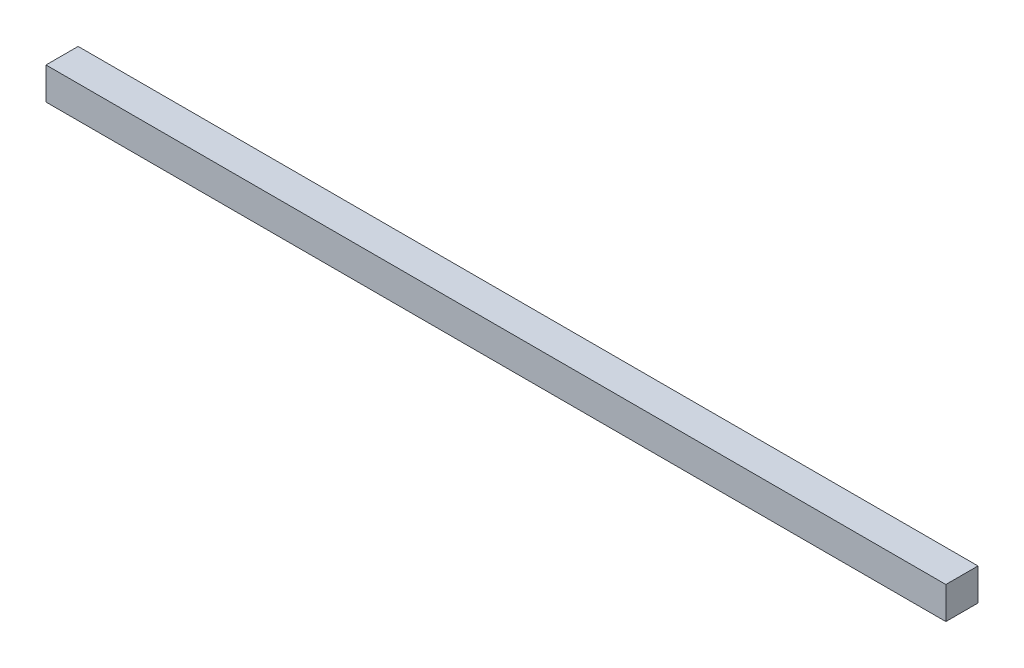
ISO-10303-21;
HEADER;
FILE_DESCRIPTION(('STEP AP214'),'2;1');
FILE_NAME('part.step','',(''),(''),'','','');
FILE_SCHEMA(('AUTOMOTIVE_DESIGN { 1 0 10303 214 1 1 1 1 }'));
ENDSEC;
DATA;
#1=APPLICATION_CONTEXT('core data for automotive mechanical design processes');
#2=APPLICATION_PROTOCOL_DEFINITION('international standard','automotive_design',2000,#1);
#3=PRODUCT_CONTEXT('',#1,'mechanical');
#4=PRODUCT('Part','Part','',(#3));
#5=PRODUCT_RELATED_PRODUCT_CATEGORY('part','',(#4));
#6=PRODUCT_DEFINITION_FORMATION('','',#4);
#7=PRODUCT_DEFINITION_CONTEXT('part definition',#1,'design');
#8=PRODUCT_DEFINITION('design','',#6,#7);
#9=PRODUCT_DEFINITION_SHAPE('','',#8);
#10=(LENGTH_UNIT() NAMED_UNIT(*) SI_UNIT(.MILLI.,.METRE.));
#11=(NAMED_UNIT(*) PLANE_ANGLE_UNIT() SI_UNIT($,.RADIAN.));
#12=(NAMED_UNIT(*) SI_UNIT($,.STERADIAN.) SOLID_ANGLE_UNIT());
#13=UNCERTAINTY_MEASURE_WITH_UNIT(LENGTH_MEASURE(1.E-05),#10,'distance_accuracy_value','');
#14=(GEOMETRIC_REPRESENTATION_CONTEXT(3) GLOBAL_UNCERTAINTY_ASSIGNED_CONTEXT((#13)) GLOBAL_UNIT_ASSIGNED_CONTEXT((#10,
#11,#12)) REPRESENTATION_CONTEXT('',''));
#15=CARTESIAN_POINT('',(0.,0.,0.));
#16=DIRECTION('',(0.,0.,1.));
#17=DIRECTION('',(1.,0.,0.));
#18=AXIS2_PLACEMENT_3D('',#15,#16,#17);
#19=CARTESIAN_POINT('',(0.,25.,25.));
#20=DIRECTION('',(1.,0.,0.));
#21=DIRECTION('',(0.,0.,-1.));
#22=AXIS2_PLACEMENT_3D('',#19,#20,#21);
#23=PLANE('',#22);
#24=DIRECTION('',(0.,-1.,0.));
#25=VECTOR('',#24,1.);
#26=CARTESIAN_POINT('',(0.,25.,0.));
#27=LINE('',#26,#25);
#28=CARTESIAN_POINT('',(0.,25.,0.));
#29=VERTEX_POINT('',#28);
#30=CARTESIAN_POINT('',(0.,0.,0.));
#31=VERTEX_POINT('',#30);
#32=EDGE_CURVE('E102',#29,#31,#27,.T.);
#33=ORIENTED_EDGE('',*,*,#32,.T.);
#34=DIRECTION('',(0.,0.,-1.));
#35=VECTOR('',#34,1.);
#36=CARTESIAN_POINT('',(0.,0.,25.));
#37=LINE('',#36,#35);
#38=CARTESIAN_POINT('',(0.,0.,25.));
#39=VERTEX_POINT('',#38);
#40=EDGE_CURVE('E11',#39,#31,#37,.T.);
#41=ORIENTED_EDGE('',*,*,#40,.F.);
#42=DIRECTION('',(0.,-1.,0.));
#43=VECTOR('',#42,1.);
#44=CARTESIAN_POINT('',(0.,25.,25.));
#45=LINE('',#44,#43);
#46=CARTESIAN_POINT('',(0.,25.,25.));
#47=VERTEX_POINT('',#46);
#48=EDGE_CURVE('E90',#47,#39,#45,.T.);
#49=ORIENTED_EDGE('',*,*,#48,.F.);
#50=DIRECTION('',(0.,0.,-1.));
#51=VECTOR('',#50,1.);
#52=CARTESIAN_POINT('',(0.,25.,25.));
#53=LINE('',#52,#51);
#54=EDGE_CURVE('E98',#47,#29,#53,.T.);
#55=ORIENTED_EDGE('',*,*,#54,.T.);
#56=EDGE_LOOP('',(#33,#41,#49,#55));
#57=FACE_BOUND('',#56,.T.);
#58=ADVANCED_FACE('F39',(#57),#23,.F.);
#59=CARTESIAN_POINT('',(0.,0.,25.));
#60=DIRECTION('',(0.,1.,0.));
#61=DIRECTION('',(0.,0.,1.));
#62=AXIS2_PLACEMENT_3D('',#59,#60,#61);
#63=PLANE('',#62);
#64=DIRECTION('',(1.,0.,0.));
#65=VECTOR('',#64,1.);
#66=CARTESIAN_POINT('',(0.,0.,0.));
#67=LINE('',#66,#65);
#68=CARTESIAN_POINT('',(700.,0.,0.));
#69=VERTEX_POINT('',#68);
#70=EDGE_CURVE('E94',#31,#69,#67,.T.);
#71=ORIENTED_EDGE('',*,*,#70,.T.);
#72=DIRECTION('',(0.,0.,-1.));
#73=VECTOR('',#72,1.);
#74=CARTESIAN_POINT('',(700.,0.,25.));
#75=LINE('',#74,#73);
#76=CARTESIAN_POINT('',(700.,0.,25.));
#77=VERTEX_POINT('',#76);
#78=EDGE_CURVE('E47',#77,#69,#75,.T.);
#79=ORIENTED_EDGE('',*,*,#78,.F.);
#80=DIRECTION('',(1.,0.,0.));
#81=VECTOR('',#80,1.);
#82=CARTESIAN_POINT('',(0.,0.,25.));
#83=LINE('',#82,#81);
#84=EDGE_CURVE('E85',#39,#77,#83,.T.);
#85=ORIENTED_EDGE('',*,*,#84,.F.);
#86=ORIENTED_EDGE('',*,*,#40,.T.);
#87=EDGE_LOOP('',(#71,#79,#85,#86));
#88=FACE_BOUND('',#87,.T.);
#89=ADVANCED_FACE('F93',(#88),#63,.F.);
#90=CARTESIAN_POINT('',(700.,0.,25.));
#91=DIRECTION('',(-1.,0.,0.));
#92=DIRECTION('',(0.,0.,1.));
#93=AXIS2_PLACEMENT_3D('',#90,#91,#92);
#94=PLANE('',#93);
#95=DIRECTION('',(0.,1.,0.));
#96=VECTOR('',#95,1.);
#97=CARTESIAN_POINT('',(700.,0.,0.));
#98=LINE('',#97,#96);
#99=CARTESIAN_POINT('',(700.,25.,0.));
#100=VERTEX_POINT('',#99);
#101=EDGE_CURVE('E72',#69,#100,#98,.T.);
#102=ORIENTED_EDGE('',*,*,#101,.T.);
#103=DIRECTION('',(0.,0.,-1.));
#104=VECTOR('',#103,1.);
#105=CARTESIAN_POINT('',(700.,25.,25.));
#106=LINE('',#105,#104);
#107=CARTESIAN_POINT('',(700.,25.,25.));
#108=VERTEX_POINT('',#107);
#109=EDGE_CURVE('E95',#108,#100,#106,.T.);
#110=ORIENTED_EDGE('',*,*,#109,.F.);
#111=DIRECTION('',(0.,1.,0.));
#112=VECTOR('',#111,1.);
#113=CARTESIAN_POINT('',(700.,0.,25.));
#114=LINE('',#113,#112);
#115=EDGE_CURVE('E88',#77,#108,#114,.T.);
#116=ORIENTED_EDGE('',*,*,#115,.F.);
#117=ORIENTED_EDGE('',*,*,#78,.T.);
#118=EDGE_LOOP('',(#102,#110,#116,#117));
#119=FACE_BOUND('',#118,.T.);
#120=ADVANCED_FACE('F96',(#119),#94,.F.);
#121=CARTESIAN_POINT('',(700.,25.,25.));
#122=DIRECTION('',(0.,-1.,0.));
#123=DIRECTION('',(0.,0.,-1.));
#124=AXIS2_PLACEMENT_3D('',#121,#122,#123);
#125=PLANE('',#124);
#126=DIRECTION('',(-1.,0.,0.));
#127=VECTOR('',#126,1.);
#128=CARTESIAN_POINT('',(700.,25.,0.));
#129=LINE('',#128,#127);
#130=EDGE_CURVE('E78',#100,#29,#129,.T.);
#131=ORIENTED_EDGE('',*,*,#130,.T.);
#132=ORIENTED_EDGE('',*,*,#54,.F.);
#133=DIRECTION('',(-1.,0.,0.));
#134=VECTOR('',#133,1.);
#135=CARTESIAN_POINT('',(700.,25.,25.));
#136=LINE('',#135,#134);
#137=EDGE_CURVE('E55',#108,#47,#136,.T.);
#138=ORIENTED_EDGE('',*,*,#137,.F.);
#139=ORIENTED_EDGE('',*,*,#109,.T.);
#140=EDGE_LOOP('',(#131,#132,#138,#139));
#141=FACE_BOUND('',#140,.T.);
#142=ADVANCED_FACE('F109',(#141),#125,.F.);
#143=CARTESIAN_POINT('',(0.,0.,25.));
#144=DIRECTION('',(0.,0.,1.));
#145=DIRECTION('',(1.,0.,0.));
#146=AXIS2_PLACEMENT_3D('',#143,#144,#145);
#147=PLANE('',#146);
#148=ORIENTED_EDGE('',*,*,#48,.T.);
#149=ORIENTED_EDGE('',*,*,#84,.T.);
#150=ORIENTED_EDGE('',*,*,#115,.T.);
#151=ORIENTED_EDGE('',*,*,#137,.T.);
#152=EDGE_LOOP('',(#148,#149,#150,#151));
#153=FACE_BOUND('',#152,.T.);
#154=ADVANCED_FACE('F86',(#153),#147,.T.);
#155=CARTESIAN_POINT('',(0.,0.,0.));
#156=DIRECTION('',(0.,0.,1.));
#157=DIRECTION('',(1.,0.,0.));
#158=AXIS2_PLACEMENT_3D('',#155,#156,#157);
#159=PLANE('',#158);
#160=ORIENTED_EDGE('',*,*,#32,.F.);
#161=ORIENTED_EDGE('',*,*,#130,.F.);
#162=ORIENTED_EDGE('',*,*,#101,.F.);
#163=ORIENTED_EDGE('',*,*,#70,.F.);
#164=EDGE_LOOP('',(#160,#161,#162,#163));
#165=FACE_BOUND('',#164,.T.);
#166=ADVANCED_FACE('F112',(#165),#159,.F.);
#167=CLOSED_SHELL('',(#58,#89,#120,#142,#154,#166));
#168=MANIFOLD_SOLID_BREP('B2',#167);
#169=ADVANCED_BREP_SHAPE_REPRESENTATION('',(#18,#168),#14);
#170=SHAPE_DEFINITION_REPRESENTATION(#9,#169);
ENDSEC;
END-ISO-10303-21;
